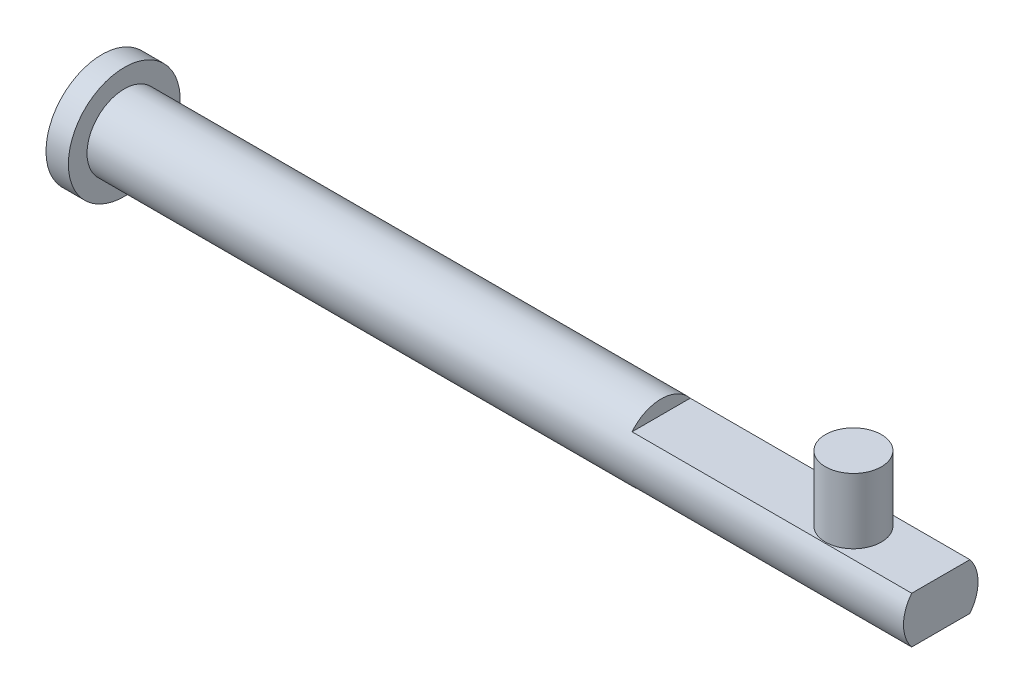
ISO-10303-21;
HEADER;
FILE_DESCRIPTION(('STEP AP214'),'2;1');
FILE_NAME('part.step','',(''),(''),'','','');
FILE_SCHEMA(('AUTOMOTIVE_DESIGN { 1 0 10303 214 1 1 1 1 }'));
ENDSEC;
DATA;
#1=APPLICATION_CONTEXT('core data for automotive mechanical design processes');
#2=APPLICATION_PROTOCOL_DEFINITION('international standard','automotive_design',2000,#1);
#3=PRODUCT_CONTEXT('',#1,'mechanical');
#4=PRODUCT('Part','Part','',(#3));
#5=PRODUCT_RELATED_PRODUCT_CATEGORY('part','',(#4));
#6=PRODUCT_DEFINITION_FORMATION('','',#4);
#7=PRODUCT_DEFINITION_CONTEXT('part definition',#1,'design');
#8=PRODUCT_DEFINITION('design','',#6,#7);
#9=PRODUCT_DEFINITION_SHAPE('','',#8);
#10=(LENGTH_UNIT() NAMED_UNIT(*) SI_UNIT(.MILLI.,.METRE.));
#11=(NAMED_UNIT(*) PLANE_ANGLE_UNIT() SI_UNIT($,.RADIAN.));
#12=(NAMED_UNIT(*) SI_UNIT($,.STERADIAN.) SOLID_ANGLE_UNIT());
#13=UNCERTAINTY_MEASURE_WITH_UNIT(LENGTH_MEASURE(1.E-05),#10,'distance_accuracy_value','');
#14=(GEOMETRIC_REPRESENTATION_CONTEXT(3) GLOBAL_UNCERTAINTY_ASSIGNED_CONTEXT((#13)) GLOBAL_UNIT_ASSIGNED_CONTEXT((#10,
#11,#12)) REPRESENTATION_CONTEXT('',''));
#15=CARTESIAN_POINT('',(0.,0.,0.));
#16=DIRECTION('',(0.,0.,1.));
#17=DIRECTION('',(1.,0.,0.));
#18=AXIS2_PLACEMENT_3D('',#15,#16,#17);
#19=CARTESIAN_POINT('',(57.7358490566037,0.,1.8));
#20=DIRECTION('',(-1.,0.,0.));
#21=DIRECTION('',(0.,0.,1.));
#22=AXIS2_PLACEMENT_3D('',#19,#20,#21);
#23=PLANE('',#22);
#24=DIRECTION('',(0.,0.,-1.));
#25=VECTOR('',#24,1.);
#26=CARTESIAN_POINT('',(57.7358490566037,-5.,-12.199160345129));
#27=LINE('',#26,#25);
#28=CARTESIAN_POINT('',(57.7358490566037,-5.,8.04499799839839));
#29=VERTEX_POINT('',#28);
#30=CARTESIAN_POINT('',(57.7358490566037,-5.,-4.44499799839839));
#31=VERTEX_POINT('',#30);
#32=EDGE_CURVE('E80',#29,#31,#27,.T.);
#33=ORIENTED_EDGE('',*,*,#32,.T.);
#34=CARTESIAN_POINT('',(57.7358490566037,0.,1.8));
#35=DIRECTION('',(-1.,0.,0.));
#36=DIRECTION('',(0.,0.,1.));
#37=AXIS2_PLACEMENT_3D('',#34,#35,#36);
#38=CIRCLE('',#37,8.);
#39=CARTESIAN_POINT('',(57.7358490566037,5.,-4.44499799839839));
#40=VERTEX_POINT('',#39);
#41=EDGE_CURVE('E89',#40,#31,#38,.T.);
#42=ORIENTED_EDGE('',*,*,#41,.F.);
#43=DIRECTION('',(0.,0.,1.));
#44=VECTOR('',#43,1.);
#45=CARTESIAN_POINT('',(57.7358490566037,5.,-12.199160345129));
#46=LINE('',#45,#44);
#47=CARTESIAN_POINT('',(57.7358490566037,5.,8.04499799839838));
#48=VERTEX_POINT('',#47);
#49=EDGE_CURVE('E70',#40,#48,#46,.T.);
#50=ORIENTED_EDGE('',*,*,#49,.T.);
#51=EDGE_CURVE('E94',#29,#48,#38,.T.);
#52=ORIENTED_EDGE('',*,*,#51,.F.);
#53=EDGE_LOOP('',(#33,#42,#50,#52));
#54=FACE_BOUND('',#53,.T.);
#55=ADVANCED_FACE('F33',(#54),#23,.F.);
#56=CARTESIAN_POINT('',(-122.264150943396,0.,1.8));
#57=DIRECTION('',(-1.,0.,0.));
#58=DIRECTION('',(0.,0.,1.));
#59=AXIS2_PLACEMENT_3D('',#56,#57,#58);
#60=CYLINDRICAL_SURFACE('',#59,7.99999999999999);
#61=CARTESIAN_POINT('',(-117.464688019993,0.,1.8));
#62=DIRECTION('',(-1.,0.,0.));
#63=DIRECTION('',(0.,0.,1.));
#64=AXIS2_PLACEMENT_3D('',#61,#62,#63);
#65=CIRCLE('',#64,7.99999999999998);
#66=CARTESIAN_POINT('',(-117.464688019993,0.,9.79999999999998));
#67=VERTEX_POINT('',#66);
#68=EDGE_CURVE('E97',#67,#67,#65,.T.);
#69=ORIENTED_EDGE('',*,*,#68,.F.);
#70=EDGE_LOOP('',(#69));
#71=FACE_BOUND('',#70,.T.);
#72=DIRECTION('',(-1.,0.,0.));
#73=VECTOR('',#72,1.);
#74=CARTESIAN_POINT('',(-122.264150943396,-5.,8.04499799839839));
#75=LINE('',#74,#73);
#76=CARTESIAN_POINT('',(-2.26415094339626,-5.,8.04499799839839));
#77=VERTEX_POINT('',#76);
#78=EDGE_CURVE('E12',#29,#77,#75,.T.);
#79=ORIENTED_EDGE('',*,*,#78,.F.);
#80=ORIENTED_EDGE('',*,*,#51,.T.);
#81=DIRECTION('',(-1.,0.,0.));
#82=VECTOR('',#81,1.);
#83=CARTESIAN_POINT('',(-122.264150943396,5.,8.04499799839838));
#84=LINE('',#83,#82);
#85=CARTESIAN_POINT('',(-2.26415094339626,5.,8.04499799839838));
#86=VERTEX_POINT('',#85);
#87=EDGE_CURVE('E75',#86,#48,#84,.F.);
#88=ORIENTED_EDGE('',*,*,#87,.F.);
#89=CARTESIAN_POINT('',(-2.26415094339626,0.,1.8));
#90=DIRECTION('',(1.,0.,0.));
#91=DIRECTION('',(0.,0.,-1.));
#92=AXIS2_PLACEMENT_3D('',#89,#90,#91);
#93=CIRCLE('',#92,7.99999999999999);
#94=CARTESIAN_POINT('',(-2.26415094339626,5.,-4.44499799839839));
#95=VERTEX_POINT('',#94);
#96=EDGE_CURVE('E90',#95,#86,#93,.T.);
#97=ORIENTED_EDGE('',*,*,#96,.F.);
#98=DIRECTION('',(-1.,0.,0.));
#99=VECTOR('',#98,1.);
#100=CARTESIAN_POINT('',(-122.264150943396,5.,-4.44499799839839));
#101=LINE('',#100,#99);
#102=EDGE_CURVE('E73',#40,#95,#101,.T.);
#103=ORIENTED_EDGE('',*,*,#102,.F.);
#104=ORIENTED_EDGE('',*,*,#41,.T.);
#105=DIRECTION('',(-1.,0.,0.));
#106=VECTOR('',#105,1.);
#107=CARTESIAN_POINT('',(-122.264150943396,-5.,-4.44499799839839));
#108=LINE('',#107,#106);
#109=CARTESIAN_POINT('',(-2.26415094339626,-5.,-4.44499799839839));
#110=VERTEX_POINT('',#109);
#111=EDGE_CURVE('E91',#110,#31,#108,.F.);
#112=ORIENTED_EDGE('',*,*,#111,.F.);
#113=EDGE_CURVE('E40',#77,#110,#93,.T.);
#114=ORIENTED_EDGE('',*,*,#113,.F.);
#115=EDGE_LOOP('',(#79,#80,#88,#97,#103,#104,#112,#114));
#116=FACE_BOUND('',#115,.T.);
#117=ADVANCED_FACE('F87',(#71,#116),#60,.T.);
#118=CARTESIAN_POINT('',(-117.464688019993,0.,-6.19999999999998));
#119=DIRECTION('',(-1.,0.,0.));
#120=DIRECTION('',(0.,0.,1.));
#121=AXIS2_PLACEMENT_3D('',#118,#119,#120);
#122=PLANE('',#121);
#123=CARTESIAN_POINT('',(-117.464688019993,0.,1.8));
#124=DIRECTION('',(-1.,0.,0.));
#125=DIRECTION('',(0.,0.,1.));
#126=AXIS2_PLACEMENT_3D('',#123,#124,#125);
#127=CIRCLE('',#126,12.);
#128=CARTESIAN_POINT('',(-117.464688019993,0.,13.8));
#129=VERTEX_POINT('',#128);
#130=EDGE_CURVE('E111',#129,#129,#127,.T.);
#131=ORIENTED_EDGE('',*,*,#130,.F.);
#132=EDGE_LOOP('',(#131));
#133=FACE_BOUND('',#132,.T.);
#134=ORIENTED_EDGE('',*,*,#68,.T.);
#135=EDGE_LOOP('',(#134));
#136=FACE_BOUND('',#135,.T.);
#137=ADVANCED_FACE('F118',(#133,#136),#122,.F.);
#138=CARTESIAN_POINT('',(-122.264150943396,0.,1.8));
#139=DIRECTION('',(-1.,0.,0.));
#140=DIRECTION('',(0.,0.,1.));
#141=AXIS2_PLACEMENT_3D('',#138,#139,#140);
#142=CYLINDRICAL_SURFACE('',#141,12.);
#143=CARTESIAN_POINT('',(-122.264150943396,0.,1.8));
#144=DIRECTION('',(-1.,0.,0.));
#145=DIRECTION('',(0.,0.,1.));
#146=AXIS2_PLACEMENT_3D('',#143,#144,#145);
#147=CIRCLE('',#146,12.);
#148=CARTESIAN_POINT('',(-122.264150943396,0.,13.8));
#149=VERTEX_POINT('',#148);
#150=EDGE_CURVE('E109',#149,#149,#147,.T.);
#151=ORIENTED_EDGE('',*,*,#150,.F.);
#152=EDGE_LOOP('',(#151));
#153=FACE_BOUND('',#152,.T.);
#154=ORIENTED_EDGE('',*,*,#130,.T.);
#155=EDGE_LOOP('',(#154));
#156=FACE_BOUND('',#155,.T.);
#157=ADVANCED_FACE('F125',(#153,#156),#142,.T.);
#158=CARTESIAN_POINT('',(-122.264150943396,0.,1.8));
#159=DIRECTION('',(1.,0.,0.));
#160=DIRECTION('',(0.,0.,-1.));
#161=AXIS2_PLACEMENT_3D('',#158,#159,#160);
#162=PLANE('',#161);
#163=ORIENTED_EDGE('',*,*,#150,.T.);
#164=EDGE_LOOP('',(#163));
#165=FACE_BOUND('',#164,.T.);
#166=ADVANCED_FACE('F131',(#165),#162,.F.);
#167=CARTESIAN_POINT('',(-2.26415094339626,5.,-12.199160345129));
#168=DIRECTION('',(0.,1.,0.));
#169=DIRECTION('',(0.,0.,1.));
#170=AXIS2_PLACEMENT_3D('',#167,#168,#169);
#171=PLANE('',#170);
#172=CARTESIAN_POINT('',(38.9858490566037,5.,1.8));
#173=DIRECTION('',(0.,1.,0.));
#174=DIRECTION('',(0.,0.,1.));
#175=AXIS2_PLACEMENT_3D('',#172,#173,#174);
#176=CIRCLE('',#175,6.);
#177=CARTESIAN_POINT('',(38.9858490566037,5.,7.8));
#178=VERTEX_POINT('',#177);
#179=EDGE_CURVE('E156',#178,#178,#176,.T.);
#180=ORIENTED_EDGE('',*,*,#179,.F.);
#181=EDGE_LOOP('',(#180));
#182=FACE_BOUND('',#181,.T.);
#183=ORIENTED_EDGE('',*,*,#102,.T.);
#184=DIRECTION('',(0.,0.,1.));
#185=VECTOR('',#184,1.);
#186=CARTESIAN_POINT('',(-2.26415094339626,5.,-12.199160345129));
#187=LINE('',#186,#185);
#188=EDGE_CURVE('E54',#95,#86,#187,.T.);
#189=ORIENTED_EDGE('',*,*,#188,.T.);
#190=ORIENTED_EDGE('',*,*,#87,.T.);
#191=ORIENTED_EDGE('',*,*,#49,.F.);
#192=EDGE_LOOP('',(#183,#189,#190,#191));
#193=FACE_BOUND('',#192,.T.);
#194=ADVANCED_FACE('F72',(#182,#193),#171,.T.);
#195=CARTESIAN_POINT('',(-2.26415094339626,0.,4.76329494865491));
#196=DIRECTION('',(1.,0.,0.));
#197=DIRECTION('',(0.,0.,-1.));
#198=AXIS2_PLACEMENT_3D('',#195,#196,#197);
#199=PLANE('',#198);
#200=ORIENTED_EDGE('',*,*,#96,.T.);
#201=ORIENTED_EDGE('',*,*,#188,.F.);
#202=EDGE_LOOP('',(#200,#201));
#203=FACE_BOUND('',#202,.T.);
#204=ADVANCED_FACE('F136',(#203),#199,.T.);
#205=ORIENTED_EDGE('',*,*,#113,.T.);
#206=DIRECTION('',(0.,0.,-1.));
#207=VECTOR('',#206,1.);
#208=CARTESIAN_POINT('',(-2.26415094339626,-5.,-12.199160345129));
#209=LINE('',#208,#207);
#210=EDGE_CURVE('E46',#77,#110,#209,.T.);
#211=ORIENTED_EDGE('',*,*,#210,.F.);
#212=EDGE_LOOP('',(#205,#211));
#213=FACE_BOUND('',#212,.T.);
#214=ADVANCED_FACE('F103',(#213),#199,.T.);
#215=CARTESIAN_POINT('',(-2.26415094339626,-5.,-12.199160345129));
#216=DIRECTION('',(0.,-1.,0.));
#217=DIRECTION('',(0.,0.,-1.));
#218=AXIS2_PLACEMENT_3D('',#215,#216,#217);
#219=PLANE('',#218);
#220=ORIENTED_EDGE('',*,*,#78,.T.);
#221=ORIENTED_EDGE('',*,*,#210,.T.);
#222=ORIENTED_EDGE('',*,*,#111,.T.);
#223=ORIENTED_EDGE('',*,*,#32,.F.);
#224=EDGE_LOOP('',(#220,#221,#222,#223));
#225=FACE_BOUND('',#224,.T.);
#226=ADVANCED_FACE('F104',(#225),#219,.T.);
#227=CARTESIAN_POINT('',(38.9858490566037,19.,1.8));
#228=DIRECTION('',(0.,-1.,0.));
#229=DIRECTION('',(0.,0.,-1.));
#230=AXIS2_PLACEMENT_3D('',#227,#228,#229);
#231=CYLINDRICAL_SURFACE('',#230,6.);
#232=CARTESIAN_POINT('',(38.9858490566037,19.,1.8));
#233=DIRECTION('',(0.,1.,0.));
#234=DIRECTION('',(0.,0.,1.));
#235=AXIS2_PLACEMENT_3D('',#232,#233,#234);
#236=CIRCLE('',#235,6.);
#237=CARTESIAN_POINT('',(38.9858490566037,19.,7.8));
#238=VERTEX_POINT('',#237);
#239=EDGE_CURVE('E81',#238,#238,#236,.T.);
#240=ORIENTED_EDGE('',*,*,#239,.F.);
#241=EDGE_LOOP('',(#240));
#242=FACE_BOUND('',#241,.T.);
#243=ORIENTED_EDGE('',*,*,#179,.T.);
#244=EDGE_LOOP('',(#243));
#245=FACE_BOUND('',#244,.T.);
#246=ADVANCED_FACE('F145',(#242,#245),#231,.T.);
#247=CARTESIAN_POINT('',(38.9858490566037,19.,1.8));
#248=DIRECTION('',(0.,1.,0.));
#249=DIRECTION('',(0.,0.,1.));
#250=AXIS2_PLACEMENT_3D('',#247,#248,#249);
#251=PLANE('',#250);
#252=ORIENTED_EDGE('',*,*,#239,.T.);
#253=EDGE_LOOP('',(#252));
#254=FACE_BOUND('',#253,.T.);
#255=ADVANCED_FACE('F148',(#254),#251,.T.);
#256=CLOSED_SHELL('',(#55,#117,#137,#157,#166,#194,#204,#214,#226,#246,#255));
#257=MANIFOLD_SOLID_BREP('B2',#256);
#258=ADVANCED_BREP_SHAPE_REPRESENTATION('',(#18,#257),#14);
#259=SHAPE_DEFINITION_REPRESENTATION(#9,#258);
ENDSEC;
END-ISO-10303-21;
